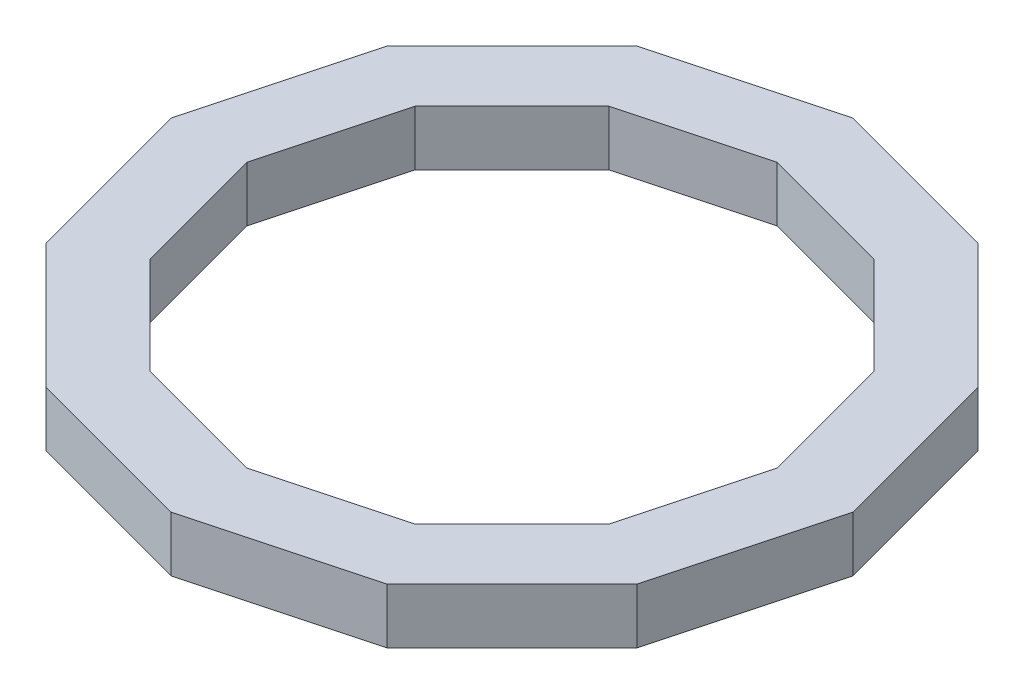
ISO-10303-21;
HEADER;
FILE_DESCRIPTION(('STEP AP214'),'2;1');
FILE_NAME('part.step','',(''),(''),'','','');
FILE_SCHEMA(('AUTOMOTIVE_DESIGN { 1 0 10303 214 1 1 1 1 }'));
ENDSEC;
DATA;
#1=APPLICATION_CONTEXT('core data for automotive mechanical design processes');
#2=APPLICATION_PROTOCOL_DEFINITION('international standard','automotive_design',2000,#1);
#3=PRODUCT_CONTEXT('',#1,'mechanical');
#4=PRODUCT('Part','Part','',(#3));
#5=PRODUCT_RELATED_PRODUCT_CATEGORY('part','',(#4));
#6=PRODUCT_DEFINITION_FORMATION('','',#4);
#7=PRODUCT_DEFINITION_CONTEXT('part definition',#1,'design');
#8=PRODUCT_DEFINITION('design','',#6,#7);
#9=PRODUCT_DEFINITION_SHAPE('','',#8);
#10=(LENGTH_UNIT() NAMED_UNIT(*) SI_UNIT(.MILLI.,.METRE.));
#11=(NAMED_UNIT(*) PLANE_ANGLE_UNIT() SI_UNIT($,.RADIAN.));
#12=(NAMED_UNIT(*) SI_UNIT($,.STERADIAN.) SOLID_ANGLE_UNIT());
#13=UNCERTAINTY_MEASURE_WITH_UNIT(LENGTH_MEASURE(1.E-05),#10,'distance_accuracy_value','');
#14=(GEOMETRIC_REPRESENTATION_CONTEXT(3) GLOBAL_UNCERTAINTY_ASSIGNED_CONTEXT((#13)) GLOBAL_UNIT_ASSIGNED_CONTEXT((#10,
#11,#12)) REPRESENTATION_CONTEXT('',''));
#15=CARTESIAN_POINT('',(0.,0.,0.));
#16=DIRECTION('',(0.,0.,1.));
#17=DIRECTION('',(1.,0.,0.));
#18=AXIS2_PLACEMENT_3D('',#15,#16,#17);
#19=CARTESIAN_POINT('',(0.,19.05,0.));
#20=DIRECTION('',(0.,1.,0.));
#21=DIRECTION('',(0.,0.,1.));
#22=AXIS2_PLACEMENT_3D('',#19,#20,#21);
#23=PLANE('',#22);
#24=DIRECTION('',(0.258819045102521,0.,-0.965925826289068));
#25=VECTOR('',#24,1.);
#26=CARTESIAN_POINT('',(101.988067751714,19.05,58.8828383705815));
#27=LINE('',#26,#25);
#28=CARTESIAN_POINT('',(101.988067751714,19.05,58.8828383705815));
#29=VERTEX_POINT('',#28);
#30=CARTESIAN_POINT('',(117.765676741163,19.05,0.));
#31=VERTEX_POINT('',#30);
#32=EDGE_CURVE('E295',#29,#31,#27,.T.);
#33=ORIENTED_EDGE('',*,*,#32,.T.);
#34=DIRECTION('',(-0.258819045102521,0.,-0.965925826289068));
#35=VECTOR('',#34,1.);
#36=CARTESIAN_POINT('',(117.765676741163,19.05,0.));
#37=LINE('',#36,#35);
#38=CARTESIAN_POINT('',(101.988067751714,19.05,-58.8828383705816));
#39=VERTEX_POINT('',#38);
#40=EDGE_CURVE('E299',#31,#39,#37,.T.);
#41=ORIENTED_EDGE('',*,*,#40,.T.);
#42=DIRECTION('',(-0.707106781186548,0.,-0.707106781186547));
#43=VECTOR('',#42,1.);
#44=CARTESIAN_POINT('',(101.988067751714,19.05,-58.8828383705816));
#45=LINE('',#44,#43);
#46=CARTESIAN_POINT('',(58.8828383705815,19.05,-101.988067751714));
#47=VERTEX_POINT('',#46);
#48=EDGE_CURVE('E303',#39,#47,#45,.T.);
#49=ORIENTED_EDGE('',*,*,#48,.T.);
#50=DIRECTION('',(-0.965925826289068,0.,-0.258819045102521));
#51=VECTOR('',#50,1.);
#52=CARTESIAN_POINT('',(58.8828383705815,19.05,-101.988067751714));
#53=LINE('',#52,#51);
#54=CARTESIAN_POINT('',(0.,19.05,-117.765676741163));
#55=VERTEX_POINT('',#54);
#56=EDGE_CURVE('E305',#47,#55,#53,.T.);
#57=ORIENTED_EDGE('',*,*,#56,.T.);
#58=DIRECTION('',(-0.965925826289068,0.,0.258819045102521));
#59=VECTOR('',#58,1.);
#60=CARTESIAN_POINT('',(0.,19.05,-117.765676741163));
#61=LINE('',#60,#59);
#62=CARTESIAN_POINT('',(-58.8828383705816,19.05,-101.988067751714));
#63=VERTEX_POINT('',#62);
#64=EDGE_CURVE('E307',#55,#63,#61,.T.);
#65=ORIENTED_EDGE('',*,*,#64,.T.);
#66=DIRECTION('',(-0.707106781186547,0.,0.707106781186548));
#67=VECTOR('',#66,1.);
#68=CARTESIAN_POINT('',(-58.8828383705816,19.05,-101.988067751714));
#69=LINE('',#68,#67);
#70=CARTESIAN_POINT('',(-101.988067751714,19.05,-58.8828383705816));
#71=VERTEX_POINT('',#70);
#72=EDGE_CURVE('E309',#63,#71,#69,.T.);
#73=ORIENTED_EDGE('',*,*,#72,.T.);
#74=DIRECTION('',(-0.258819045102521,0.,0.965925826289068));
#75=VECTOR('',#74,1.);
#76=CARTESIAN_POINT('',(-101.988067751714,19.05,-58.8828383705816));
#77=LINE('',#76,#75);
#78=CARTESIAN_POINT('',(-117.765676741163,19.05,0.));
#79=VERTEX_POINT('',#78);
#80=EDGE_CURVE('E312',#71,#79,#77,.T.);
#81=ORIENTED_EDGE('',*,*,#80,.T.);
#82=DIRECTION('',(0.25881904510252,0.,0.965925826289068));
#83=VECTOR('',#82,1.);
#84=CARTESIAN_POINT('',(-117.765676741163,19.05,0.));
#85=LINE('',#84,#83);
#86=CARTESIAN_POINT('',(-101.988067751714,19.05,58.8828383705816));
#87=VERTEX_POINT('',#86);
#88=EDGE_CURVE('E315',#79,#87,#85,.T.);
#89=ORIENTED_EDGE('',*,*,#88,.T.);
#90=DIRECTION('',(0.707106781186548,0.,0.707106781186548));
#91=VECTOR('',#90,1.);
#92=CARTESIAN_POINT('',(-101.988067751714,19.05,58.8828383705816));
#93=LINE('',#92,#91);
#94=CARTESIAN_POINT('',(-58.8828383705816,19.05,101.988067751714));
#95=VERTEX_POINT('',#94);
#96=EDGE_CURVE('E317',#87,#95,#93,.T.);
#97=ORIENTED_EDGE('',*,*,#96,.T.);
#98=DIRECTION('',(0.965925826289068,0.,0.258819045102521));
#99=VECTOR('',#98,1.);
#100=CARTESIAN_POINT('',(-58.8828383705816,19.05,101.988067751714));
#101=LINE('',#100,#99);
#102=CARTESIAN_POINT('',(0.,19.05,117.765676741163));
#103=VERTEX_POINT('',#102);
#104=EDGE_CURVE('E319',#95,#103,#101,.T.);
#105=ORIENTED_EDGE('',*,*,#104,.T.);
#106=DIRECTION('',(0.965925826289068,0.,-0.258819045102521));
#107=VECTOR('',#106,1.);
#108=CARTESIAN_POINT('',(0.,19.05,117.765676741163));
#109=LINE('',#108,#107);
#110=CARTESIAN_POINT('',(58.8828383705816,19.05,101.988067751714));
#111=VERTEX_POINT('',#110);
#112=EDGE_CURVE('E321',#103,#111,#109,.T.);
#113=ORIENTED_EDGE('',*,*,#112,.T.);
#114=DIRECTION('',(0.707106781186547,0.,-0.707106781186547));
#115=VECTOR('',#114,1.);
#116=CARTESIAN_POINT('',(58.8828383705816,19.05,101.988067751714));
#117=LINE('',#116,#115);
#118=EDGE_CURVE('E323',#111,#29,#117,.T.);
#119=ORIENTED_EDGE('',*,*,#118,.T.);
#120=EDGE_LOOP('',(#33,#41,#49,#57,#65,#73,#81,#89,#97,#105,#113,#119));
#121=FACE_BOUND('',#120,.T.);
#122=DIRECTION('',(-0.258819045102521,0.,-0.965925826289068));
#123=VECTOR('',#122,1.);
#124=CARTESIAN_POINT('',(91.4696617587471,19.05,0.));
#125=LINE('',#124,#123);
#126=CARTESIAN_POINT('',(91.4696617587471,19.05,0.));
#127=VERTEX_POINT('',#126);
#128=CARTESIAN_POINT('',(79.215050758645,19.05,-45.7348308793735));
#129=VERTEX_POINT('',#128);
#130=EDGE_CURVE('E205',#127,#129,#125,.T.);
#131=ORIENTED_EDGE('',*,*,#130,.F.);
#132=DIRECTION('',(0.258819045102521,0.,-0.965925826289068));
#133=VECTOR('',#132,1.);
#134=CARTESIAN_POINT('',(79.2150507586449,19.05,45.7348308793735));
#135=LINE('',#134,#133);
#136=CARTESIAN_POINT('',(79.2150507586449,19.05,45.7348308793735));
#137=VERTEX_POINT('',#136);
#138=EDGE_CURVE('E196',#137,#127,#135,.T.);
#139=ORIENTED_EDGE('',*,*,#138,.F.);
#140=DIRECTION('',(0.707106781186547,0.,-0.707106781186548));
#141=VECTOR('',#140,1.);
#142=CARTESIAN_POINT('',(45.7348308793735,19.05,79.215050758645));
#143=LINE('',#142,#141);
#144=CARTESIAN_POINT('',(45.7348308793735,19.05,79.215050758645));
#145=VERTEX_POINT('',#144);
#146=EDGE_CURVE('E241',#145,#137,#143,.T.);
#147=ORIENTED_EDGE('',*,*,#146,.F.);
#148=DIRECTION('',(0.965925826289068,0.,-0.258819045102521));
#149=VECTOR('',#148,1.);
#150=CARTESIAN_POINT('',(0.,19.05,91.4696617587471));
#151=LINE('',#150,#149);
#152=CARTESIAN_POINT('',(0.,19.05,91.4696617587471));
#153=VERTEX_POINT('',#152);
#154=EDGE_CURVE('E238',#153,#145,#151,.T.);
#155=ORIENTED_EDGE('',*,*,#154,.F.);
#156=DIRECTION('',(0.965925826289068,0.,0.258819045102521));
#157=VECTOR('',#156,1.);
#158=CARTESIAN_POINT('',(-45.7348308793735,19.05,79.215050758645));
#159=LINE('',#158,#157);
#160=CARTESIAN_POINT('',(-45.7348308793735,19.05,79.215050758645));
#161=VERTEX_POINT('',#160);
#162=EDGE_CURVE('E236',#161,#153,#159,.T.);
#163=ORIENTED_EDGE('',*,*,#162,.F.);
#164=DIRECTION('',(0.707106781186548,0.,0.707106781186547));
#165=VECTOR('',#164,1.);
#166=CARTESIAN_POINT('',(-79.215050758645,19.05,45.7348308793735));
#167=LINE('',#166,#165);
#168=CARTESIAN_POINT('',(-79.215050758645,19.05,45.7348308793735));
#169=VERTEX_POINT('',#168);
#170=EDGE_CURVE('E234',#169,#161,#167,.T.);
#171=ORIENTED_EDGE('',*,*,#170,.F.);
#172=DIRECTION('',(0.258819045102521,0.,0.965925826289068));
#173=VECTOR('',#172,1.);
#174=CARTESIAN_POINT('',(-91.4696617587471,19.05,0.));
#175=LINE('',#174,#173);
#176=CARTESIAN_POINT('',(-91.4696617587471,19.05,0.));
#177=VERTEX_POINT('',#176);
#178=EDGE_CURVE('E232',#177,#169,#175,.T.);
#179=ORIENTED_EDGE('',*,*,#178,.F.);
#180=DIRECTION('',(-0.258819045102521,0.,0.965925826289068));
#181=VECTOR('',#180,1.);
#182=CARTESIAN_POINT('',(-79.215050758645,19.05,-45.7348308793735));
#183=LINE('',#182,#181);
#184=CARTESIAN_POINT('',(-79.215050758645,19.05,-45.7348308793735));
#185=VERTEX_POINT('',#184);
#186=EDGE_CURVE('E229',#185,#177,#183,.T.);
#187=ORIENTED_EDGE('',*,*,#186,.F.);
#188=DIRECTION('',(-0.707106781186547,0.,0.707106781186548));
#189=VECTOR('',#188,1.);
#190=CARTESIAN_POINT('',(-45.7348308793736,19.05,-79.2150507586449));
#191=LINE('',#190,#189);
#192=CARTESIAN_POINT('',(-45.7348308793736,19.05,-79.2150507586449));
#193=VERTEX_POINT('',#192);
#194=EDGE_CURVE('E227',#193,#185,#191,.T.);
#195=ORIENTED_EDGE('',*,*,#194,.F.);
#196=DIRECTION('',(-0.965925826289068,0.,0.258819045102521));
#197=VECTOR('',#196,1.);
#198=CARTESIAN_POINT('',(0.,19.05,-91.4696617587471));
#199=LINE('',#198,#197);
#200=CARTESIAN_POINT('',(0.,19.05,-91.4696617587471));
#201=VERTEX_POINT('',#200);
#202=EDGE_CURVE('E224',#201,#193,#199,.T.);
#203=ORIENTED_EDGE('',*,*,#202,.F.);
#204=DIRECTION('',(-0.965925826289068,0.,-0.258819045102521));
#205=VECTOR('',#204,1.);
#206=CARTESIAN_POINT('',(45.7348308793735,19.05,-79.215050758645));
#207=LINE('',#206,#205);
#208=CARTESIAN_POINT('',(45.7348308793735,19.05,-79.215050758645));
#209=VERTEX_POINT('',#208);
#210=EDGE_CURVE('E220',#209,#201,#207,.T.);
#211=ORIENTED_EDGE('',*,*,#210,.F.);
#212=DIRECTION('',(-0.707106781186548,0.,-0.707106781186548));
#213=VECTOR('',#212,1.);
#214=CARTESIAN_POINT('',(79.215050758645,19.05,-45.7348308793735));
#215=LINE('',#214,#213);
#216=EDGE_CURVE('E218',#129,#209,#215,.T.);
#217=ORIENTED_EDGE('',*,*,#216,.F.);
#218=EDGE_LOOP('',(#131,#139,#147,#155,#163,#171,#179,#187,#195,#203,#211,#217));
#219=FACE_BOUND('',#218,.T.);
#220=ADVANCED_FACE('F35',(#121,#219),#23,.T.);
#221=CARTESIAN_POINT('',(0.,0.,0.));
#222=DIRECTION('',(0.,1.,0.));
#223=DIRECTION('',(0.,0.,1.));
#224=AXIS2_PLACEMENT_3D('',#221,#222,#223);
#225=PLANE('',#224);
#226=DIRECTION('',(0.258819045102521,0.,-0.965925826289068));
#227=VECTOR('',#226,1.);
#228=CARTESIAN_POINT('',(101.988067751714,0.,58.8828383705815));
#229=LINE('',#228,#227);
#230=CARTESIAN_POINT('',(101.988067751714,0.,58.8828383705815));
#231=VERTEX_POINT('',#230);
#232=CARTESIAN_POINT('',(117.765676741163,0.,0.));
#233=VERTEX_POINT('',#232);
#234=EDGE_CURVE('E213',#231,#233,#229,.T.);
#235=ORIENTED_EDGE('',*,*,#234,.F.);
#236=DIRECTION('',(0.707106781186547,0.,-0.707106781186547));
#237=VECTOR('',#236,1.);
#238=CARTESIAN_POINT('',(58.8828383705816,0.,101.988067751714));
#239=LINE('',#238,#237);
#240=CARTESIAN_POINT('',(58.8828383705816,0.,101.988067751714));
#241=VERTEX_POINT('',#240);
#242=EDGE_CURVE('E300',#241,#231,#239,.T.);
#243=ORIENTED_EDGE('',*,*,#242,.F.);
#244=DIRECTION('',(0.965925826289068,0.,-0.258819045102521));
#245=VECTOR('',#244,1.);
#246=CARTESIAN_POINT('',(0.,0.,117.765676741163));
#247=LINE('',#246,#245);
#248=CARTESIAN_POINT('',(0.,0.,117.765676741163));
#249=VERTEX_POINT('',#248);
#250=EDGE_CURVE('E346',#249,#241,#247,.T.);
#251=ORIENTED_EDGE('',*,*,#250,.F.);
#252=DIRECTION('',(0.965925826289068,0.,0.258819045102521));
#253=VECTOR('',#252,1.);
#254=CARTESIAN_POINT('',(-58.8828383705816,0.,101.988067751714));
#255=LINE('',#254,#253);
#256=CARTESIAN_POINT('',(-58.8828383705816,0.,101.988067751714));
#257=VERTEX_POINT('',#256);
#258=EDGE_CURVE('E344',#257,#249,#255,.T.);
#259=ORIENTED_EDGE('',*,*,#258,.F.);
#260=DIRECTION('',(0.707106781186548,0.,0.707106781186548));
#261=VECTOR('',#260,1.);
#262=CARTESIAN_POINT('',(-101.988067751714,0.,58.8828383705816));
#263=LINE('',#262,#261);
#264=CARTESIAN_POINT('',(-101.988067751714,0.,58.8828383705816));
#265=VERTEX_POINT('',#264);
#266=EDGE_CURVE('E342',#265,#257,#263,.T.);
#267=ORIENTED_EDGE('',*,*,#266,.F.);
#268=DIRECTION('',(0.25881904510252,0.,0.965925826289068));
#269=VECTOR('',#268,1.);
#270=CARTESIAN_POINT('',(-117.765676741163,0.,0.));
#271=LINE('',#270,#269);
#272=CARTESIAN_POINT('',(-117.765676741163,0.,0.));
#273=VERTEX_POINT('',#272);
#274=EDGE_CURVE('E340',#273,#265,#271,.T.);
#275=ORIENTED_EDGE('',*,*,#274,.F.);
#276=DIRECTION('',(-0.258819045102521,0.,0.965925826289068));
#277=VECTOR('',#276,1.);
#278=CARTESIAN_POINT('',(-101.988067751714,0.,-58.8828383705816));
#279=LINE('',#278,#277);
#280=CARTESIAN_POINT('',(-101.988067751714,0.,-58.8828383705816));
#281=VERTEX_POINT('',#280);
#282=EDGE_CURVE('E338',#281,#273,#279,.T.);
#283=ORIENTED_EDGE('',*,*,#282,.F.);
#284=DIRECTION('',(-0.707106781186547,0.,0.707106781186548));
#285=VECTOR('',#284,1.);
#286=CARTESIAN_POINT('',(-58.8828383705816,0.,-101.988067751714));
#287=LINE('',#286,#285);
#288=CARTESIAN_POINT('',(-58.8828383705816,0.,-101.988067751714));
#289=VERTEX_POINT('',#288);
#290=EDGE_CURVE('E336',#289,#281,#287,.T.);
#291=ORIENTED_EDGE('',*,*,#290,.F.);
#292=DIRECTION('',(-0.965925826289068,0.,0.258819045102521));
#293=VECTOR('',#292,1.);
#294=CARTESIAN_POINT('',(0.,0.,-117.765676741163));
#295=LINE('',#294,#293);
#296=CARTESIAN_POINT('',(0.,0.,-117.765676741163));
#297=VERTEX_POINT('',#296);
#298=EDGE_CURVE('E334',#297,#289,#295,.T.);
#299=ORIENTED_EDGE('',*,*,#298,.F.);
#300=DIRECTION('',(-0.965925826289068,0.,-0.258819045102521));
#301=VECTOR('',#300,1.);
#302=CARTESIAN_POINT('',(58.8828383705815,0.,-101.988067751714));
#303=LINE('',#302,#301);
#304=CARTESIAN_POINT('',(58.8828383705815,0.,-101.988067751714));
#305=VERTEX_POINT('',#304);
#306=EDGE_CURVE('E332',#305,#297,#303,.T.);
#307=ORIENTED_EDGE('',*,*,#306,.F.);
#308=DIRECTION('',(-0.707106781186548,0.,-0.707106781186547));
#309=VECTOR('',#308,1.);
#310=CARTESIAN_POINT('',(101.988067751714,0.,-58.8828383705816));
#311=LINE('',#310,#309);
#312=CARTESIAN_POINT('',(101.988067751714,0.,-58.8828383705816));
#313=VERTEX_POINT('',#312);
#314=EDGE_CURVE('E330',#313,#305,#311,.T.);
#315=ORIENTED_EDGE('',*,*,#314,.F.);
#316=DIRECTION('',(-0.258819045102521,0.,-0.965925826289068));
#317=VECTOR('',#316,1.);
#318=CARTESIAN_POINT('',(117.765676741163,0.,0.));
#319=LINE('',#318,#317);
#320=EDGE_CURVE('E328',#233,#313,#319,.T.);
#321=ORIENTED_EDGE('',*,*,#320,.F.);
#322=EDGE_LOOP('',(#235,#243,#251,#259,#267,#275,#283,#291,#299,#307,#315,#321));
#323=FACE_BOUND('',#322,.T.);
#324=DIRECTION('',(0.258819045102521,0.,-0.965925826289068));
#325=VECTOR('',#324,1.);
#326=CARTESIAN_POINT('',(79.2150507586449,0.,45.7348308793735));
#327=LINE('',#326,#325);
#328=CARTESIAN_POINT('',(79.2150507586449,0.,45.7348308793735));
#329=VERTEX_POINT('',#328);
#330=CARTESIAN_POINT('',(91.4696617587471,0.,0.));
#331=VERTEX_POINT('',#330);
#332=EDGE_CURVE('E58',#329,#331,#327,.T.);
#333=ORIENTED_EDGE('',*,*,#332,.T.);
#334=DIRECTION('',(-0.258819045102521,0.,-0.965925826289068));
#335=VECTOR('',#334,1.);
#336=CARTESIAN_POINT('',(91.4696617587471,0.,0.));
#337=LINE('',#336,#335);
#338=CARTESIAN_POINT('',(79.215050758645,0.,-45.7348308793735));
#339=VERTEX_POINT('',#338);
#340=EDGE_CURVE('E212',#331,#339,#337,.T.);
#341=ORIENTED_EDGE('',*,*,#340,.T.);
#342=DIRECTION('',(-0.707106781186548,0.,-0.707106781186548));
#343=VECTOR('',#342,1.);
#344=CARTESIAN_POINT('',(79.215050758645,0.,-45.7348308793735));
#345=LINE('',#344,#343);
#346=CARTESIAN_POINT('',(45.7348308793735,0.,-79.215050758645));
#347=VERTEX_POINT('',#346);
#348=EDGE_CURVE('E246',#339,#347,#345,.T.);
#349=ORIENTED_EDGE('',*,*,#348,.T.);
#350=DIRECTION('',(-0.965925826289068,0.,-0.258819045102521));
#351=VECTOR('',#350,1.);
#352=CARTESIAN_POINT('',(45.7348308793735,0.,-79.215050758645));
#353=LINE('',#352,#351);
#354=CARTESIAN_POINT('',(0.,0.,-91.4696617587471));
#355=VERTEX_POINT('',#354);
#356=EDGE_CURVE('E249',#347,#355,#353,.T.);
#357=ORIENTED_EDGE('',*,*,#356,.T.);
#358=DIRECTION('',(-0.965925826289068,0.,0.258819045102521));
#359=VECTOR('',#358,1.);
#360=CARTESIAN_POINT('',(0.,0.,-91.4696617587471));
#361=LINE('',#360,#359);
#362=CARTESIAN_POINT('',(-45.7348308793736,0.,-79.2150507586449));
#363=VERTEX_POINT('',#362);
#364=EDGE_CURVE('E252',#355,#363,#361,.T.);
#365=ORIENTED_EDGE('',*,*,#364,.T.);
#366=DIRECTION('',(-0.707106781186547,0.,0.707106781186548));
#367=VECTOR('',#366,1.);
#368=CARTESIAN_POINT('',(-45.7348308793736,0.,-79.2150507586449));
#369=LINE('',#368,#367);
#370=CARTESIAN_POINT('',(-79.215050758645,0.,-45.7348308793735));
#371=VERTEX_POINT('',#370);
#372=EDGE_CURVE('E255',#363,#371,#369,.T.);
#373=ORIENTED_EDGE('',*,*,#372,.T.);
#374=DIRECTION('',(-0.258819045102521,0.,0.965925826289068));
#375=VECTOR('',#374,1.);
#376=CARTESIAN_POINT('',(-79.215050758645,0.,-45.7348308793735));
#377=LINE('',#376,#375);
#378=CARTESIAN_POINT('',(-91.4696617587471,0.,0.));
#379=VERTEX_POINT('',#378);
#380=EDGE_CURVE('E258',#371,#379,#377,.T.);
#381=ORIENTED_EDGE('',*,*,#380,.T.);
#382=DIRECTION('',(0.258819045102521,0.,0.965925826289068));
#383=VECTOR('',#382,1.);
#384=CARTESIAN_POINT('',(-91.4696617587471,0.,0.));
#385=LINE('',#384,#383);
#386=CARTESIAN_POINT('',(-79.215050758645,0.,45.7348308793735));
#387=VERTEX_POINT('',#386);
#388=EDGE_CURVE('E262',#379,#387,#385,.T.);
#389=ORIENTED_EDGE('',*,*,#388,.T.);
#390=DIRECTION('',(0.707106781186548,0.,0.707106781186547));
#391=VECTOR('',#390,1.);
#392=CARTESIAN_POINT('',(-79.215050758645,0.,45.7348308793735));
#393=LINE('',#392,#391);
#394=CARTESIAN_POINT('',(-45.7348308793735,0.,79.215050758645));
#395=VERTEX_POINT('',#394);
#396=EDGE_CURVE('E265',#387,#395,#393,.T.);
#397=ORIENTED_EDGE('',*,*,#396,.T.);
#398=DIRECTION('',(0.965925826289068,0.,0.258819045102521));
#399=VECTOR('',#398,1.);
#400=CARTESIAN_POINT('',(-45.7348308793735,0.,79.215050758645));
#401=LINE('',#400,#399);
#402=CARTESIAN_POINT('',(0.,0.,91.4696617587471));
#403=VERTEX_POINT('',#402);
#404=EDGE_CURVE('E268',#395,#403,#401,.T.);
#405=ORIENTED_EDGE('',*,*,#404,.T.);
#406=DIRECTION('',(0.965925826289068,0.,-0.258819045102521));
#407=VECTOR('',#406,1.);
#408=CARTESIAN_POINT('',(0.,0.,91.4696617587471));
#409=LINE('',#408,#407);
#410=CARTESIAN_POINT('',(45.7348308793735,0.,79.215050758645));
#411=VERTEX_POINT('',#410);
#412=EDGE_CURVE('E271',#403,#411,#409,.T.);
#413=ORIENTED_EDGE('',*,*,#412,.T.);
#414=DIRECTION('',(0.707106781186547,0.,-0.707106781186548));
#415=VECTOR('',#414,1.);
#416=CARTESIAN_POINT('',(45.7348308793735,0.,79.215050758645));
#417=LINE('',#416,#415);
#418=EDGE_CURVE('E206',#411,#329,#417,.T.);
#419=ORIENTED_EDGE('',*,*,#418,.T.);
#420=EDGE_LOOP('',(#333,#341,#349,#357,#365,#373,#381,#389,#397,#405,#413,#419));
#421=FACE_BOUND('',#420,.T.);
#422=ADVANCED_FACE('F391',(#323,#421),#225,.F.);
#423=CARTESIAN_POINT('',(101.988067751714,19.05,58.8828383705815));
#424=DIRECTION('',(-0.965925826289068,0.,-0.258819045102521));
#425=DIRECTION('',(-0.258819045102521,0.,0.965925826289068));
#426=AXIS2_PLACEMENT_3D('',#423,#424,#425);
#427=PLANE('',#426);
#428=ORIENTED_EDGE('',*,*,#234,.T.);
#429=DIRECTION('',(0.,-1.,0.));
#430=VECTOR('',#429,1.);
#431=CARTESIAN_POINT('',(117.765676741163,19.05,0.));
#432=LINE('',#431,#430);
#433=EDGE_CURVE('E11',#31,#233,#432,.T.);
#434=ORIENTED_EDGE('',*,*,#433,.F.);
#435=ORIENTED_EDGE('',*,*,#32,.F.);
#436=DIRECTION('',(0.,-1.,0.));
#437=VECTOR('',#436,1.);
#438=CARTESIAN_POINT('',(101.988067751714,19.05,58.8828383705815));
#439=LINE('',#438,#437);
#440=EDGE_CURVE('E325',#29,#231,#439,.T.);
#441=ORIENTED_EDGE('',*,*,#440,.T.);
#442=EDGE_LOOP('',(#428,#434,#435,#441));
#443=FACE_BOUND('',#442,.T.);
#444=ADVANCED_FACE('F37',(#443),#427,.F.);
#445=CARTESIAN_POINT('',(117.765676741163,19.05,0.));
#446=DIRECTION('',(-0.965925826289068,0.,0.258819045102521));
#447=DIRECTION('',(0.258819045102521,0.,0.965925826289068));
#448=AXIS2_PLACEMENT_3D('',#445,#446,#447);
#449=PLANE('',#448);
#450=ORIENTED_EDGE('',*,*,#320,.T.);
#451=DIRECTION('',(0.,-1.,0.));
#452=VECTOR('',#451,1.);
#453=CARTESIAN_POINT('',(101.988067751714,19.05,-58.8828383705816));
#454=LINE('',#453,#452);
#455=EDGE_CURVE('E43',#39,#313,#454,.T.);
#456=ORIENTED_EDGE('',*,*,#455,.F.);
#457=ORIENTED_EDGE('',*,*,#40,.F.);
#458=ORIENTED_EDGE('',*,*,#433,.T.);
#459=EDGE_LOOP('',(#450,#456,#457,#458));
#460=FACE_BOUND('',#459,.T.);
#461=ADVANCED_FACE('F408',(#460),#449,.F.);
#462=CARTESIAN_POINT('',(101.988067751714,19.05,-58.8828383705816));
#463=DIRECTION('',(-0.707106781186547,0.,0.707106781186548));
#464=DIRECTION('',(0.707106781186548,0.,0.707106781186547));
#465=AXIS2_PLACEMENT_3D('',#462,#463,#464);
#466=PLANE('',#465);
#467=ORIENTED_EDGE('',*,*,#314,.T.);
#468=DIRECTION('',(0.,-1.,0.));
#469=VECTOR('',#468,1.);
#470=CARTESIAN_POINT('',(58.8828383705815,19.05,-101.988067751714));
#471=LINE('',#470,#469);
#472=EDGE_CURVE('E378',#47,#305,#471,.T.);
#473=ORIENTED_EDGE('',*,*,#472,.F.);
#474=ORIENTED_EDGE('',*,*,#48,.F.);
#475=ORIENTED_EDGE('',*,*,#455,.T.);
#476=EDGE_LOOP('',(#467,#473,#474,#475));
#477=FACE_BOUND('',#476,.T.);
#478=ADVANCED_FACE('F385',(#477),#466,.F.);
#479=CARTESIAN_POINT('',(58.8828383705815,19.05,-101.988067751714));
#480=DIRECTION('',(-0.258819045102521,0.,0.965925826289068));
#481=DIRECTION('',(0.965925826289068,0.,0.258819045102521));
#482=AXIS2_PLACEMENT_3D('',#479,#480,#481);
#483=PLANE('',#482);
#484=ORIENTED_EDGE('',*,*,#306,.T.);
#485=DIRECTION('',(0.,-1.,0.));
#486=VECTOR('',#485,1.);
#487=CARTESIAN_POINT('',(0.,19.05,-117.765676741163));
#488=LINE('',#487,#486);
#489=EDGE_CURVE('E375',#55,#297,#488,.T.);
#490=ORIENTED_EDGE('',*,*,#489,.F.);
#491=ORIENTED_EDGE('',*,*,#56,.F.);
#492=ORIENTED_EDGE('',*,*,#472,.T.);
#493=EDGE_LOOP('',(#484,#490,#491,#492));
#494=FACE_BOUND('',#493,.T.);
#495=ADVANCED_FACE('F397',(#494),#483,.F.);
#496=CARTESIAN_POINT('',(0.,19.05,-117.765676741163));
#497=DIRECTION('',(0.258819045102521,0.,0.965925826289068));
#498=DIRECTION('',(0.965925826289068,0.,-0.258819045102521));
#499=AXIS2_PLACEMENT_3D('',#496,#497,#498);
#500=PLANE('',#499);
#501=ORIENTED_EDGE('',*,*,#298,.T.);
#502=DIRECTION('',(0.,-1.,0.));
#503=VECTOR('',#502,1.);
#504=CARTESIAN_POINT('',(-58.8828383705816,19.05,-101.988067751714));
#505=LINE('',#504,#503);
#506=EDGE_CURVE('E371',#63,#289,#505,.T.);
#507=ORIENTED_EDGE('',*,*,#506,.F.);
#508=ORIENTED_EDGE('',*,*,#64,.F.);
#509=ORIENTED_EDGE('',*,*,#489,.T.);
#510=EDGE_LOOP('',(#501,#507,#508,#509));
#511=FACE_BOUND('',#510,.T.);
#512=ADVANCED_FACE('F401',(#511),#500,.F.);
#513=CARTESIAN_POINT('',(-58.8828383705816,19.05,-101.988067751714));
#514=DIRECTION('',(0.707106781186548,0.,0.707106781186547));
#515=DIRECTION('',(0.707106781186547,0.,-0.707106781186548));
#516=AXIS2_PLACEMENT_3D('',#513,#514,#515);
#517=PLANE('',#516);
#518=ORIENTED_EDGE('',*,*,#290,.T.);
#519=DIRECTION('',(0.,-1.,0.));
#520=VECTOR('',#519,1.);
#521=CARTESIAN_POINT('',(-101.988067751714,19.05,-58.8828383705816));
#522=LINE('',#521,#520);
#523=EDGE_CURVE('E367',#71,#281,#522,.T.);
#524=ORIENTED_EDGE('',*,*,#523,.F.);
#525=ORIENTED_EDGE('',*,*,#72,.F.);
#526=ORIENTED_EDGE('',*,*,#506,.T.);
#527=EDGE_LOOP('',(#518,#524,#525,#526));
#528=FACE_BOUND('',#527,.T.);
#529=ADVANCED_FACE('F441',(#528),#517,.F.);
#530=CARTESIAN_POINT('',(-101.988067751714,19.05,-58.8828383705816));
#531=DIRECTION('',(0.965925826289068,0.,0.258819045102521));
#532=DIRECTION('',(0.258819045102521,0.,-0.965925826289068));
#533=AXIS2_PLACEMENT_3D('',#530,#531,#532);
#534=PLANE('',#533);
#535=ORIENTED_EDGE('',*,*,#282,.T.);
#536=DIRECTION('',(0.,-1.,0.));
#537=VECTOR('',#536,1.);
#538=CARTESIAN_POINT('',(-117.765676741163,19.05,0.));
#539=LINE('',#538,#537);
#540=EDGE_CURVE('E364',#79,#273,#539,.T.);
#541=ORIENTED_EDGE('',*,*,#540,.F.);
#542=ORIENTED_EDGE('',*,*,#80,.F.);
#543=ORIENTED_EDGE('',*,*,#523,.T.);
#544=EDGE_LOOP('',(#535,#541,#542,#543));
#545=FACE_BOUND('',#544,.T.);
#546=ADVANCED_FACE('F439',(#545),#534,.F.);
#547=CARTESIAN_POINT('',(-117.765676741163,19.05,0.));
#548=DIRECTION('',(0.965925826289068,0.,-0.25881904510252));
#549=DIRECTION('',(-0.25881904510252,0.,-0.965925826289068));
#550=AXIS2_PLACEMENT_3D('',#547,#548,#549);
#551=PLANE('',#550);
#552=ORIENTED_EDGE('',*,*,#274,.T.);
#553=DIRECTION('',(0.,-1.,0.));
#554=VECTOR('',#553,1.);
#555=CARTESIAN_POINT('',(-101.988067751714,19.05,58.8828383705816));
#556=LINE('',#555,#554);
#557=EDGE_CURVE('E360',#87,#265,#556,.T.);
#558=ORIENTED_EDGE('',*,*,#557,.F.);
#559=ORIENTED_EDGE('',*,*,#88,.F.);
#560=ORIENTED_EDGE('',*,*,#540,.T.);
#561=EDGE_LOOP('',(#552,#558,#559,#560));
#562=FACE_BOUND('',#561,.T.);
#563=ADVANCED_FACE('F435',(#562),#551,.F.);
#564=CARTESIAN_POINT('',(-101.988067751714,19.05,58.8828383705816));
#565=DIRECTION('',(0.707106781186548,0.,-0.707106781186548));
#566=DIRECTION('',(-0.707106781186548,0.,-0.707106781186548));
#567=AXIS2_PLACEMENT_3D('',#564,#565,#566);
#568=PLANE('',#567);
#569=ORIENTED_EDGE('',*,*,#266,.T.);
#570=DIRECTION('',(0.,-1.,0.));
#571=VECTOR('',#570,1.);
#572=CARTESIAN_POINT('',(-58.8828383705816,19.05,101.988067751714));
#573=LINE('',#572,#571);
#574=EDGE_CURVE('E357',#95,#257,#573,.T.);
#575=ORIENTED_EDGE('',*,*,#574,.F.);
#576=ORIENTED_EDGE('',*,*,#96,.F.);
#577=ORIENTED_EDGE('',*,*,#557,.T.);
#578=EDGE_LOOP('',(#569,#575,#576,#577));
#579=FACE_BOUND('',#578,.T.);
#580=ADVANCED_FACE('F430',(#579),#568,.F.);
#581=CARTESIAN_POINT('',(-58.8828383705816,19.05,101.988067751714));
#582=DIRECTION('',(0.258819045102521,0.,-0.965925826289068));
#583=DIRECTION('',(-0.965925826289068,0.,-0.258819045102521));
#584=AXIS2_PLACEMENT_3D('',#581,#582,#583);
#585=PLANE('',#584);
#586=ORIENTED_EDGE('',*,*,#258,.T.);
#587=DIRECTION('',(0.,-1.,0.));
#588=VECTOR('',#587,1.);
#589=CARTESIAN_POINT('',(0.,19.05,117.765676741163));
#590=LINE('',#589,#588);
#591=EDGE_CURVE('E354',#103,#249,#590,.T.);
#592=ORIENTED_EDGE('',*,*,#591,.F.);
#593=ORIENTED_EDGE('',*,*,#104,.F.);
#594=ORIENTED_EDGE('',*,*,#574,.T.);
#595=EDGE_LOOP('',(#586,#592,#593,#594));
#596=FACE_BOUND('',#595,.T.);
#597=ADVANCED_FACE('F424',(#596),#585,.F.);
#598=CARTESIAN_POINT('',(0.,19.05,117.765676741163));
#599=DIRECTION('',(-0.258819045102521,0.,-0.965925826289068));
#600=DIRECTION('',(-0.965925826289068,0.,0.258819045102521));
#601=AXIS2_PLACEMENT_3D('',#598,#599,#600);
#602=PLANE('',#601);
#603=ORIENTED_EDGE('',*,*,#250,.T.);
#604=DIRECTION('',(0.,-1.,0.));
#605=VECTOR('',#604,1.);
#606=CARTESIAN_POINT('',(58.8828383705816,19.05,101.988067751714));
#607=LINE('',#606,#605);
#608=EDGE_CURVE('E351',#111,#241,#607,.T.);
#609=ORIENTED_EDGE('',*,*,#608,.F.);
#610=ORIENTED_EDGE('',*,*,#112,.F.);
#611=ORIENTED_EDGE('',*,*,#591,.T.);
#612=EDGE_LOOP('',(#603,#609,#610,#611));
#613=FACE_BOUND('',#612,.T.);
#614=ADVANCED_FACE('F420',(#613),#602,.F.);
#615=CARTESIAN_POINT('',(58.8828383705816,19.05,101.988067751714));
#616=DIRECTION('',(-0.707106781186547,0.,-0.707106781186547));
#617=DIRECTION('',(-0.707106781186548,0.,0.707106781186548));
#618=AXIS2_PLACEMENT_3D('',#615,#616,#617);
#619=PLANE('',#618);
#620=ORIENTED_EDGE('',*,*,#242,.T.);
#621=ORIENTED_EDGE('',*,*,#440,.F.);
#622=ORIENTED_EDGE('',*,*,#118,.F.);
#623=ORIENTED_EDGE('',*,*,#608,.T.);
#624=EDGE_LOOP('',(#620,#621,#622,#623));
#625=FACE_BOUND('',#624,.T.);
#626=ADVANCED_FACE('F415',(#625),#619,.F.);
#627=CARTESIAN_POINT('',(79.2150507586449,19.05,45.7348308793735));
#628=DIRECTION('',(-0.965925826289068,0.,-0.258819045102521));
#629=DIRECTION('',(-0.258819045102521,0.,0.965925826289068));
#630=AXIS2_PLACEMENT_3D('',#627,#628,#629);
#631=PLANE('',#630);
#632=ORIENTED_EDGE('',*,*,#332,.F.);
#633=DIRECTION('',(0.,-1.,0.));
#634=VECTOR('',#633,1.);
#635=CARTESIAN_POINT('',(79.2150507586449,19.05,45.7348308793735));
#636=LINE('',#635,#634);
#637=EDGE_CURVE('E200',#137,#329,#636,.T.);
#638=ORIENTED_EDGE('',*,*,#637,.F.);
#639=ORIENTED_EDGE('',*,*,#138,.T.);
#640=DIRECTION('',(0.,-1.,0.));
#641=VECTOR('',#640,1.);
#642=CARTESIAN_POINT('',(91.4696617587471,19.05,0.));
#643=LINE('',#642,#641);
#644=EDGE_CURVE('E199',#127,#331,#643,.T.);
#645=ORIENTED_EDGE('',*,*,#644,.T.);
#646=EDGE_LOOP('',(#632,#638,#639,#645));
#647=FACE_BOUND('',#646,.T.);
#648=ADVANCED_FACE('F198',(#647),#631,.T.);
#649=CARTESIAN_POINT('',(91.4696617587471,19.05,0.));
#650=DIRECTION('',(-0.965925826289068,0.,0.258819045102521));
#651=DIRECTION('',(0.258819045102521,0.,0.965925826289068));
#652=AXIS2_PLACEMENT_3D('',#649,#650,#651);
#653=PLANE('',#652);
#654=ORIENTED_EDGE('',*,*,#340,.F.);
#655=ORIENTED_EDGE('',*,*,#644,.F.);
#656=ORIENTED_EDGE('',*,*,#130,.T.);
#657=DIRECTION('',(0.,-1.,0.));
#658=VECTOR('',#657,1.);
#659=CARTESIAN_POINT('',(79.215050758645,19.05,-45.7348308793735));
#660=LINE('',#659,#658);
#661=EDGE_CURVE('E214',#129,#339,#660,.T.);
#662=ORIENTED_EDGE('',*,*,#661,.T.);
#663=EDGE_LOOP('',(#654,#655,#656,#662));
#664=FACE_BOUND('',#663,.T.);
#665=ADVANCED_FACE('F209',(#664),#653,.T.);
#666=CARTESIAN_POINT('',(79.215050758645,19.05,-45.7348308793735));
#667=DIRECTION('',(-0.707106781186547,0.,0.707106781186548));
#668=DIRECTION('',(0.707106781186548,0.,0.707106781186547));
#669=AXIS2_PLACEMENT_3D('',#666,#667,#668);
#670=PLANE('',#669);
#671=ORIENTED_EDGE('',*,*,#348,.F.);
#672=ORIENTED_EDGE('',*,*,#661,.F.);
#673=ORIENTED_EDGE('',*,*,#216,.T.);
#674=DIRECTION('',(0.,-1.,0.));
#675=VECTOR('',#674,1.);
#676=CARTESIAN_POINT('',(45.7348308793735,19.05,-79.215050758645));
#677=LINE('',#676,#675);
#678=EDGE_CURVE('E292',#209,#347,#677,.T.);
#679=ORIENTED_EDGE('',*,*,#678,.T.);
#680=EDGE_LOOP('',(#671,#672,#673,#679));
#681=FACE_BOUND('',#680,.T.);
#682=ADVANCED_FACE('F499',(#681),#670,.T.);
#683=CARTESIAN_POINT('',(45.7348308793735,19.05,-79.215050758645));
#684=DIRECTION('',(-0.258819045102521,0.,0.965925826289068));
#685=DIRECTION('',(0.965925826289068,0.,0.258819045102521));
#686=AXIS2_PLACEMENT_3D('',#683,#684,#685);
#687=PLANE('',#686);
#688=ORIENTED_EDGE('',*,*,#356,.F.);
#689=ORIENTED_EDGE('',*,*,#678,.F.);
#690=ORIENTED_EDGE('',*,*,#210,.T.);
#691=DIRECTION('',(0.,-1.,0.));
#692=VECTOR('',#691,1.);
#693=CARTESIAN_POINT('',(0.,19.05,-91.4696617587471));
#694=LINE('',#693,#692);
#695=EDGE_CURVE('E290',#201,#355,#694,.T.);
#696=ORIENTED_EDGE('',*,*,#695,.T.);
#697=EDGE_LOOP('',(#688,#689,#690,#696));
#698=FACE_BOUND('',#697,.T.);
#699=ADVANCED_FACE('F505',(#698),#687,.T.);
#700=CARTESIAN_POINT('',(0.,19.05,-91.4696617587471));
#701=DIRECTION('',(0.258819045102521,0.,0.965925826289068));
#702=DIRECTION('',(0.965925826289068,0.,-0.258819045102521));
#703=AXIS2_PLACEMENT_3D('',#700,#701,#702);
#704=PLANE('',#703);
#705=ORIENTED_EDGE('',*,*,#364,.F.);
#706=ORIENTED_EDGE('',*,*,#695,.F.);
#707=ORIENTED_EDGE('',*,*,#202,.T.);
#708=DIRECTION('',(0.,-1.,0.));
#709=VECTOR('',#708,1.);
#710=CARTESIAN_POINT('',(-45.7348308793736,19.05,-79.2150507586449));
#711=LINE('',#710,#709);
#712=EDGE_CURVE('E288',#193,#363,#711,.T.);
#713=ORIENTED_EDGE('',*,*,#712,.T.);
#714=EDGE_LOOP('',(#705,#706,#707,#713));
#715=FACE_BOUND('',#714,.T.);
#716=ADVANCED_FACE('F513',(#715),#704,.T.);
#717=CARTESIAN_POINT('',(-45.7348308793736,19.05,-79.2150507586449));
#718=DIRECTION('',(0.707106781186548,0.,0.707106781186547));
#719=DIRECTION('',(0.707106781186547,0.,-0.707106781186548));
#720=AXIS2_PLACEMENT_3D('',#717,#718,#719);
#721=PLANE('',#720);
#722=ORIENTED_EDGE('',*,*,#372,.F.);
#723=ORIENTED_EDGE('',*,*,#712,.F.);
#724=ORIENTED_EDGE('',*,*,#194,.T.);
#725=DIRECTION('',(0.,-1.,0.));
#726=VECTOR('',#725,1.);
#727=CARTESIAN_POINT('',(-79.215050758645,19.05,-45.7348308793735));
#728=LINE('',#727,#726);
#729=EDGE_CURVE('E286',#185,#371,#728,.T.);
#730=ORIENTED_EDGE('',*,*,#729,.T.);
#731=EDGE_LOOP('',(#722,#723,#724,#730));
#732=FACE_BOUND('',#731,.T.);
#733=ADVANCED_FACE('F521',(#732),#721,.T.);
#734=CARTESIAN_POINT('',(-79.215050758645,19.05,-45.7348308793735));
#735=DIRECTION('',(0.965925826289068,0.,0.258819045102521));
#736=DIRECTION('',(0.258819045102521,0.,-0.965925826289068));
#737=AXIS2_PLACEMENT_3D('',#734,#735,#736);
#738=PLANE('',#737);
#739=ORIENTED_EDGE('',*,*,#380,.F.);
#740=ORIENTED_EDGE('',*,*,#729,.F.);
#741=ORIENTED_EDGE('',*,*,#186,.T.);
#742=DIRECTION('',(0.,-1.,0.));
#743=VECTOR('',#742,1.);
#744=CARTESIAN_POINT('',(-91.4696617587471,19.05,0.));
#745=LINE('',#744,#743);
#746=EDGE_CURVE('E284',#177,#379,#745,.T.);
#747=ORIENTED_EDGE('',*,*,#746,.T.);
#748=EDGE_LOOP('',(#739,#740,#741,#747));
#749=FACE_BOUND('',#748,.T.);
#750=ADVANCED_FACE('F529',(#749),#738,.T.);
#751=CARTESIAN_POINT('',(-91.4696617587471,19.05,0.));
#752=DIRECTION('',(0.965925826289068,0.,-0.258819045102521));
#753=DIRECTION('',(-0.258819045102521,0.,-0.965925826289068));
#754=AXIS2_PLACEMENT_3D('',#751,#752,#753);
#755=PLANE('',#754);
#756=ORIENTED_EDGE('',*,*,#388,.F.);
#757=ORIENTED_EDGE('',*,*,#746,.F.);
#758=ORIENTED_EDGE('',*,*,#178,.T.);
#759=DIRECTION('',(0.,-1.,0.));
#760=VECTOR('',#759,1.);
#761=CARTESIAN_POINT('',(-79.215050758645,19.05,45.7348308793735));
#762=LINE('',#761,#760);
#763=EDGE_CURVE('E282',#169,#387,#762,.T.);
#764=ORIENTED_EDGE('',*,*,#763,.T.);
#765=EDGE_LOOP('',(#756,#757,#758,#764));
#766=FACE_BOUND('',#765,.T.);
#767=ADVANCED_FACE('F537',(#766),#755,.T.);
#768=CARTESIAN_POINT('',(-79.215050758645,19.05,45.7348308793735));
#769=DIRECTION('',(0.707106781186547,0.,-0.707106781186548));
#770=DIRECTION('',(-0.707106781186548,0.,-0.707106781186547));
#771=AXIS2_PLACEMENT_3D('',#768,#769,#770);
#772=PLANE('',#771);
#773=ORIENTED_EDGE('',*,*,#396,.F.);
#774=ORIENTED_EDGE('',*,*,#763,.F.);
#775=ORIENTED_EDGE('',*,*,#170,.T.);
#776=DIRECTION('',(0.,-1.,0.));
#777=VECTOR('',#776,1.);
#778=CARTESIAN_POINT('',(-45.7348308793735,19.05,79.215050758645));
#779=LINE('',#778,#777);
#780=EDGE_CURVE('E280',#161,#395,#779,.T.);
#781=ORIENTED_EDGE('',*,*,#780,.T.);
#782=EDGE_LOOP('',(#773,#774,#775,#781));
#783=FACE_BOUND('',#782,.T.);
#784=ADVANCED_FACE('F545',(#783),#772,.T.);
#785=CARTESIAN_POINT('',(-45.7348308793735,19.05,79.215050758645));
#786=DIRECTION('',(0.258819045102521,0.,-0.965925826289068));
#787=DIRECTION('',(-0.965925826289068,0.,-0.258819045102521));
#788=AXIS2_PLACEMENT_3D('',#785,#786,#787);
#789=PLANE('',#788);
#790=ORIENTED_EDGE('',*,*,#404,.F.);
#791=ORIENTED_EDGE('',*,*,#780,.F.);
#792=ORIENTED_EDGE('',*,*,#162,.T.);
#793=DIRECTION('',(0.,-1.,0.));
#794=VECTOR('',#793,1.);
#795=CARTESIAN_POINT('',(0.,19.05,91.4696617587471));
#796=LINE('',#795,#794);
#797=EDGE_CURVE('E278',#153,#403,#796,.T.);
#798=ORIENTED_EDGE('',*,*,#797,.T.);
#799=EDGE_LOOP('',(#790,#791,#792,#798));
#800=FACE_BOUND('',#799,.T.);
#801=ADVANCED_FACE('F553',(#800),#789,.T.);
#802=CARTESIAN_POINT('',(0.,19.05,91.4696617587471));
#803=DIRECTION('',(-0.258819045102521,0.,-0.965925826289068));
#804=DIRECTION('',(-0.965925826289068,0.,0.258819045102521));
#805=AXIS2_PLACEMENT_3D('',#802,#803,#804);
#806=PLANE('',#805);
#807=ORIENTED_EDGE('',*,*,#412,.F.);
#808=ORIENTED_EDGE('',*,*,#797,.F.);
#809=ORIENTED_EDGE('',*,*,#154,.T.);
#810=DIRECTION('',(0.,-1.,0.));
#811=VECTOR('',#810,1.);
#812=CARTESIAN_POINT('',(45.7348308793735,19.05,79.215050758645));
#813=LINE('',#812,#811);
#814=EDGE_CURVE('E50',#145,#411,#813,.T.);
#815=ORIENTED_EDGE('',*,*,#814,.T.);
#816=EDGE_LOOP('',(#807,#808,#809,#815));
#817=FACE_BOUND('',#816,.T.);
#818=ADVANCED_FACE('F561',(#817),#806,.T.);
#819=CARTESIAN_POINT('',(45.7348308793735,19.05,79.215050758645));
#820=DIRECTION('',(-0.707106781186548,0.,-0.707106781186547));
#821=DIRECTION('',(-0.707106781186547,0.,0.707106781186548));
#822=AXIS2_PLACEMENT_3D('',#819,#820,#821);
#823=PLANE('',#822);
#824=ORIENTED_EDGE('',*,*,#418,.F.);
#825=ORIENTED_EDGE('',*,*,#814,.F.);
#826=ORIENTED_EDGE('',*,*,#146,.T.);
#827=ORIENTED_EDGE('',*,*,#637,.T.);
#828=EDGE_LOOP('',(#824,#825,#826,#827));
#829=FACE_BOUND('',#828,.T.);
#830=ADVANCED_FACE('F569',(#829),#823,.T.);
#831=CLOSED_SHELL('',(#220,#422,#444,#461,#478,#495,#512,#529,#546,#563,#580,#597,#614,#626,
#648,#665,#682,#699,#716,#733,#750,#767,#784,#801,#818,#830));
#832=MANIFOLD_SOLID_BREP('B2',#831);
#833=ADVANCED_BREP_SHAPE_REPRESENTATION('',(#18,#832),#14);
#834=SHAPE_DEFINITION_REPRESENTATION(#9,#833);
ENDSEC;
END-ISO-10303-21;
